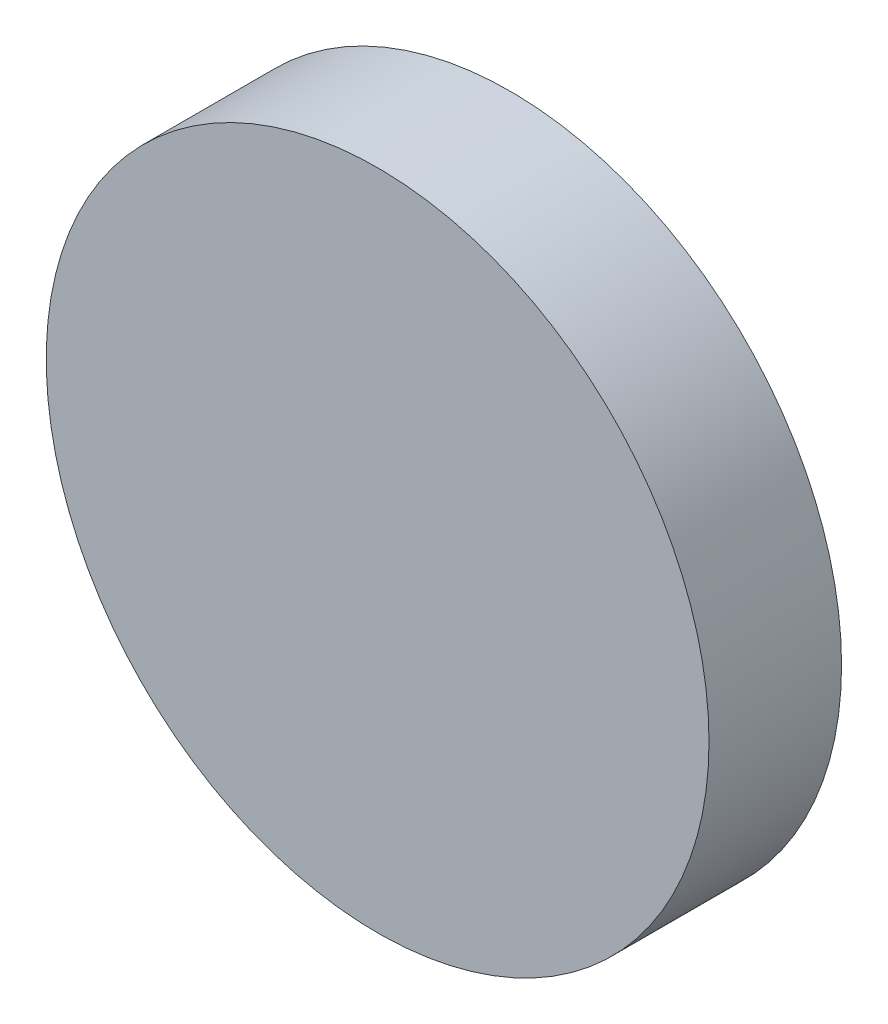
ISO-10303-21;
HEADER;
FILE_DESCRIPTION(('STEP AP214'),'2;1');
FILE_NAME('part.step','',(''),(''),'','','');
FILE_SCHEMA(('AUTOMOTIVE_DESIGN { 1 0 10303 214 1 1 1 1 }'));
ENDSEC;
DATA;
#1=APPLICATION_CONTEXT('core data for automotive mechanical design processes');
#2=APPLICATION_PROTOCOL_DEFINITION('international standard','automotive_design',2000,#1);
#3=PRODUCT_CONTEXT('',#1,'mechanical');
#4=PRODUCT('Part','Part','',(#3));
#5=PRODUCT_RELATED_PRODUCT_CATEGORY('part','',(#4));
#6=PRODUCT_DEFINITION_FORMATION('','',#4);
#7=PRODUCT_DEFINITION_CONTEXT('part definition',#1,'design');
#8=PRODUCT_DEFINITION('design','',#6,#7);
#9=PRODUCT_DEFINITION_SHAPE('','',#8);
#10=(LENGTH_UNIT() NAMED_UNIT(*) SI_UNIT(.MILLI.,.METRE.));
#11=(NAMED_UNIT(*) PLANE_ANGLE_UNIT() SI_UNIT($,.RADIAN.));
#12=(NAMED_UNIT(*) SI_UNIT($,.STERADIAN.) SOLID_ANGLE_UNIT());
#13=UNCERTAINTY_MEASURE_WITH_UNIT(LENGTH_MEASURE(1.E-05),#10,'distance_accuracy_value','');
#14=(GEOMETRIC_REPRESENTATION_CONTEXT(3) GLOBAL_UNCERTAINTY_ASSIGNED_CONTEXT((#13)) GLOBAL_UNIT_ASSIGNED_CONTEXT((#10,
#11,#12)) REPRESENTATION_CONTEXT('',''));
#15=CARTESIAN_POINT('',(0.,0.,0.));
#16=DIRECTION('',(0.,0.,1.));
#17=DIRECTION('',(1.,0.,0.));
#18=AXIS2_PLACEMENT_3D('',#15,#16,#17);
#19=CARTESIAN_POINT('',(0.,0.,0.5));
#20=DIRECTION('',(0.,0.,-1.));
#21=DIRECTION('',(-1.,0.,0.));
#22=AXIS2_PLACEMENT_3D('',#19,#20,#21);
#23=CYLINDRICAL_SURFACE('',#22,2.5);
#24=CARTESIAN_POINT('',(0.,0.,0.5));
#25=DIRECTION('',(0.,0.,1.));
#26=DIRECTION('',(1.,0.,0.));
#27=AXIS2_PLACEMENT_3D('',#24,#25,#26);
#28=CIRCLE('',#27,2.5);
#29=CARTESIAN_POINT('',(2.5,0.,0.5));
#30=VERTEX_POINT('',#29);
#31=EDGE_CURVE('E10',#30,#30,#28,.T.);
#32=ORIENTED_EDGE('',*,*,#31,.F.);
#33=EDGE_LOOP('',(#32));
#34=FACE_BOUND('',#33,.T.);
#35=CARTESIAN_POINT('',(0.,0.,-0.5));
#36=DIRECTION('',(0.,0.,1.));
#37=DIRECTION('',(1.,0.,0.));
#38=AXIS2_PLACEMENT_3D('',#35,#36,#37);
#39=CIRCLE('',#38,2.5);
#40=CARTESIAN_POINT('',(2.5,0.,-0.5));
#41=VERTEX_POINT('',#40);
#42=EDGE_CURVE('E40',#41,#41,#39,.T.);
#43=ORIENTED_EDGE('',*,*,#42,.T.);
#44=EDGE_LOOP('',(#43));
#45=FACE_BOUND('',#44,.T.);
#46=ADVANCED_FACE('F37',(#34,#45),#23,.T.);
#47=CARTESIAN_POINT('',(0.,0.,0.5));
#48=DIRECTION('',(0.,0.,1.));
#49=DIRECTION('',(1.,0.,0.));
#50=AXIS2_PLACEMENT_3D('',#47,#48,#49);
#51=PLANE('',#50);
#52=ORIENTED_EDGE('',*,*,#31,.T.);
#53=EDGE_LOOP('',(#52));
#54=FACE_BOUND('',#53,.T.);
#55=ADVANCED_FACE('F52',(#54),#51,.T.);
#56=CARTESIAN_POINT('',(0.,0.,-0.5));
#57=DIRECTION('',(0.,0.,1.));
#58=DIRECTION('',(1.,0.,0.));
#59=AXIS2_PLACEMENT_3D('',#56,#57,#58);
#60=PLANE('',#59);
#61=ORIENTED_EDGE('',*,*,#42,.F.);
#62=EDGE_LOOP('',(#61));
#63=FACE_BOUND('',#62,.T.);
#64=ADVANCED_FACE('F50',(#63),#60,.F.);
#65=CLOSED_SHELL('',(#46,#55,#64));
#66=MANIFOLD_SOLID_BREP('B2',#65);
#67=ADVANCED_BREP_SHAPE_REPRESENTATION('',(#18,#66),#14);
#68=SHAPE_DEFINITION_REPRESENTATION(#9,#67);
ENDSEC;
END-ISO-10303-21;
